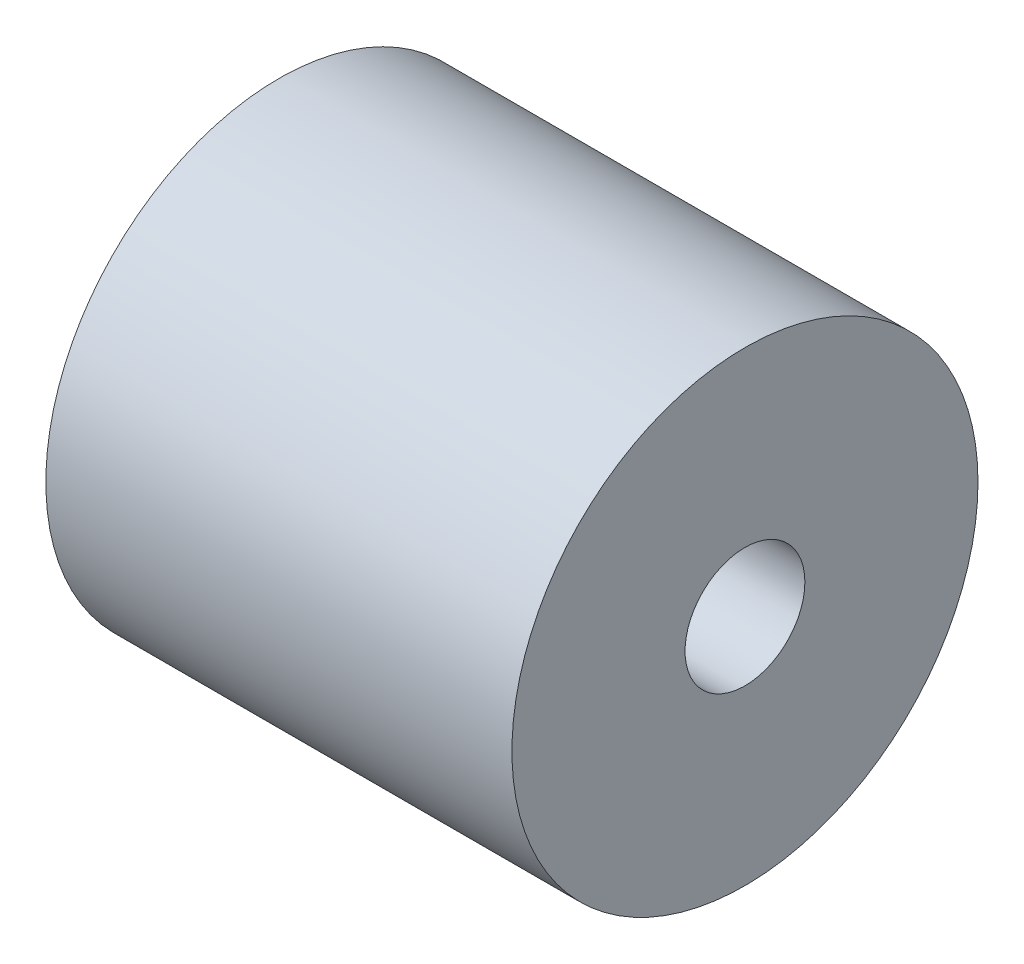
ISO-10303-21;
HEADER;
FILE_DESCRIPTION(('STEP AP214'),'2;1');
FILE_NAME('part.step','',(''),(''),'','','');
FILE_SCHEMA(('AUTOMOTIVE_DESIGN { 1 0 10303 214 1 1 1 1 }'));
ENDSEC;
DATA;
#1=APPLICATION_CONTEXT('core data for automotive mechanical design processes');
#2=APPLICATION_PROTOCOL_DEFINITION('international standard','automotive_design',2000,#1);
#3=PRODUCT_CONTEXT('',#1,'mechanical');
#4=PRODUCT('Part','Part','',(#3));
#5=PRODUCT_RELATED_PRODUCT_CATEGORY('part','',(#4));
#6=PRODUCT_DEFINITION_FORMATION('','',#4);
#7=PRODUCT_DEFINITION_CONTEXT('part definition',#1,'design');
#8=PRODUCT_DEFINITION('design','',#6,#7);
#9=PRODUCT_DEFINITION_SHAPE('','',#8);
#10=(LENGTH_UNIT() NAMED_UNIT(*) SI_UNIT(.MILLI.,.METRE.));
#11=(NAMED_UNIT(*) PLANE_ANGLE_UNIT() SI_UNIT($,.RADIAN.));
#12=(NAMED_UNIT(*) SI_UNIT($,.STERADIAN.) SOLID_ANGLE_UNIT());
#13=UNCERTAINTY_MEASURE_WITH_UNIT(LENGTH_MEASURE(1.E-05),#10,'distance_accuracy_value','');
#14=(GEOMETRIC_REPRESENTATION_CONTEXT(3) GLOBAL_UNCERTAINTY_ASSIGNED_CONTEXT((#13)) GLOBAL_UNIT_ASSIGNED_CONTEXT((#10,
#11,#12)) REPRESENTATION_CONTEXT('',''));
#15=CARTESIAN_POINT('',(0.,0.,0.));
#16=DIRECTION('',(0.,0.,1.));
#17=DIRECTION('',(1.,0.,0.));
#18=AXIS2_PLACEMENT_3D('',#15,#16,#17);
#19=CARTESIAN_POINT('',(14.,0.,0.));
#20=DIRECTION('',(1.,0.,0.));
#21=DIRECTION('',(0.,0.,-1.));
#22=AXIS2_PLACEMENT_3D('',#19,#20,#21);
#23=PLANE('',#22);
#24=CARTESIAN_POINT('',(14.,0.,0.));
#25=DIRECTION('',(1.,0.,0.));
#26=DIRECTION('',(0.,0.,-1.));
#27=AXIS2_PLACEMENT_3D('',#24,#25,#26);
#28=CIRCLE('',#27,7.);
#29=CARTESIAN_POINT('',(14.,0.,-7.));
#30=VERTEX_POINT('',#29);
#31=EDGE_CURVE('E10',#30,#30,#28,.T.);
#32=ORIENTED_EDGE('',*,*,#31,.T.);
#33=EDGE_LOOP('',(#32));
#34=FACE_BOUND('',#33,.T.);
#35=CARTESIAN_POINT('',(14.,0.,0.));
#36=DIRECTION('',(1.,0.,0.));
#37=DIRECTION('',(0.,0.,-1.));
#38=AXIS2_PLACEMENT_3D('',#35,#36,#37);
#39=CIRCLE('',#38,1.8);
#40=CARTESIAN_POINT('',(14.,0.,-1.8));
#41=VERTEX_POINT('',#40);
#42=EDGE_CURVE('E56',#41,#41,#39,.T.);
#43=ORIENTED_EDGE('',*,*,#42,.F.);
#44=EDGE_LOOP('',(#43));
#45=FACE_BOUND('',#44,.T.);
#46=ADVANCED_FACE('F43',(#34,#45),#23,.T.);
#47=CARTESIAN_POINT('',(0.,0.,0.));
#48=DIRECTION('',(1.,0.,0.));
#49=DIRECTION('',(0.,0.,-1.));
#50=AXIS2_PLACEMENT_3D('',#47,#48,#49);
#51=PLANE('',#50);
#52=CARTESIAN_POINT('',(0.,0.,0.));
#53=DIRECTION('',(1.,0.,0.));
#54=DIRECTION('',(0.,0.,-1.));
#55=AXIS2_PLACEMENT_3D('',#52,#53,#54);
#56=CIRCLE('',#55,7.);
#57=CARTESIAN_POINT('',(0.,0.,-7.));
#58=VERTEX_POINT('',#57);
#59=EDGE_CURVE('E47',#58,#58,#56,.T.);
#60=ORIENTED_EDGE('',*,*,#59,.F.);
#61=EDGE_LOOP('',(#60));
#62=FACE_BOUND('',#61,.T.);
#63=CARTESIAN_POINT('',(0.,0.,0.));
#64=DIRECTION('',(1.,0.,0.));
#65=DIRECTION('',(0.,0.,-1.));
#66=AXIS2_PLACEMENT_3D('',#63,#64,#65);
#67=CIRCLE('',#66,1.8);
#68=CARTESIAN_POINT('',(0.,0.,-1.8));
#69=VERTEX_POINT('',#68);
#70=EDGE_CURVE('E58',#69,#69,#67,.T.);
#71=ORIENTED_EDGE('',*,*,#70,.T.);
#72=EDGE_LOOP('',(#71));
#73=FACE_BOUND('',#72,.T.);
#74=ADVANCED_FACE('F70',(#62,#73),#51,.F.);
#75=CARTESIAN_POINT('',(14.,0.,0.));
#76=DIRECTION('',(-1.,0.,0.));
#77=DIRECTION('',(0.,0.,1.));
#78=AXIS2_PLACEMENT_3D('',#75,#76,#77);
#79=CYLINDRICAL_SURFACE('',#78,7.);
#80=ORIENTED_EDGE('',*,*,#31,.F.);
#81=EDGE_LOOP('',(#80));
#82=FACE_BOUND('',#81,.T.);
#83=ORIENTED_EDGE('',*,*,#59,.T.);
#84=EDGE_LOOP('',(#83));
#85=FACE_BOUND('',#84,.T.);
#86=ADVANCED_FACE('F45',(#82,#85),#79,.T.);
#87=CARTESIAN_POINT('',(14.,0.,0.));
#88=DIRECTION('',(-1.,0.,0.));
#89=DIRECTION('',(0.,0.,1.));
#90=AXIS2_PLACEMENT_3D('',#87,#88,#89);
#91=CYLINDRICAL_SURFACE('',#90,1.8);
#92=ORIENTED_EDGE('',*,*,#42,.T.);
#93=EDGE_LOOP('',(#92));
#94=FACE_BOUND('',#93,.T.);
#95=ORIENTED_EDGE('',*,*,#70,.F.);
#96=EDGE_LOOP('',(#95));
#97=FACE_BOUND('',#96,.T.);
#98=ADVANCED_FACE('F66',(#94,#97),#91,.F.);
#99=CLOSED_SHELL('',(#46,#74,#86,#98));
#100=MANIFOLD_SOLID_BREP('B2',#99);
#101=ADVANCED_BREP_SHAPE_REPRESENTATION('',(#18,#100),#14);
#102=SHAPE_DEFINITION_REPRESENTATION(#9,#101);
ENDSEC;
END-ISO-10303-21;
